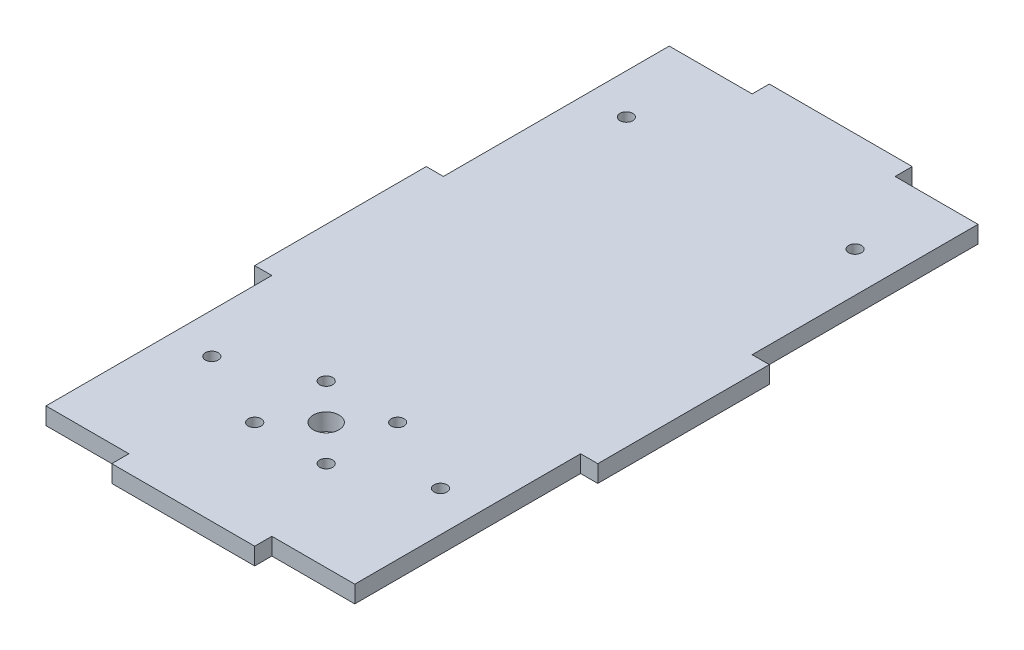
ISO-10303-21;
HEADER;
FILE_DESCRIPTION(('STEP AP214'),'2;1');
FILE_NAME('part.step','',(''),(''),'','','');
FILE_SCHEMA(('AUTOMOTIVE_DESIGN { 1 0 10303 214 1 1 1 1 }'));
ENDSEC;
DATA;
#1=APPLICATION_CONTEXT('core data for automotive mechanical design processes');
#2=APPLICATION_PROTOCOL_DEFINITION('international standard','automotive_design',2000,#1);
#3=PRODUCT_CONTEXT('',#1,'mechanical');
#4=PRODUCT('Part','Part','',(#3));
#5=PRODUCT_RELATED_PRODUCT_CATEGORY('part','',(#4));
#6=PRODUCT_DEFINITION_FORMATION('','',#4);
#7=PRODUCT_DEFINITION_CONTEXT('part definition',#1,'design');
#8=PRODUCT_DEFINITION('design','',#6,#7);
#9=PRODUCT_DEFINITION_SHAPE('','',#8);
#10=(LENGTH_UNIT() NAMED_UNIT(*) SI_UNIT(.MILLI.,.METRE.));
#11=(NAMED_UNIT(*) PLANE_ANGLE_UNIT() SI_UNIT($,.RADIAN.));
#12=(NAMED_UNIT(*) SI_UNIT($,.STERADIAN.) SOLID_ANGLE_UNIT());
#13=UNCERTAINTY_MEASURE_WITH_UNIT(LENGTH_MEASURE(1.E-05),#10,'distance_accuracy_value','');
#14=(GEOMETRIC_REPRESENTATION_CONTEXT(3) GLOBAL_UNCERTAINTY_ASSIGNED_CONTEXT((#13)) GLOBAL_UNIT_ASSIGNED_CONTEXT((#10,
#11,#12)) REPRESENTATION_CONTEXT('',''));
#15=CARTESIAN_POINT('',(0.,0.,0.));
#16=DIRECTION('',(0.,0.,1.));
#17=DIRECTION('',(1.,0.,0.));
#18=AXIS2_PLACEMENT_3D('',#15,#16,#17);
#19=CARTESIAN_POINT('',(0.,-3.,0.));
#20=DIRECTION('',(0.,1.,0.));
#21=DIRECTION('',(0.,0.,1.));
#22=AXIS2_PLACEMENT_3D('',#19,#20,#21);
#23=PLANE('',#22);
#24=CARTESIAN_POINT('',(12.5000000000052,-3.,77.5000000000028));
#25=DIRECTION('',(0.,1.,0.));
#26=DIRECTION('',(0.,0.,1.));
#27=AXIS2_PLACEMENT_3D('',#24,#25,#26);
#28=CIRCLE('',#27,2.25);
#29=CARTESIAN_POINT('',(12.5000000000052,-3.,79.7500000000028));
#30=VERTEX_POINT('',#29);
#31=EDGE_CURVE('E436',#30,#30,#28,.T.);
#32=ORIENTED_EDGE('',*,*,#31,.T.);
#33=EDGE_LOOP('',(#32));
#34=FACE_BOUND('',#33,.T.);
#35=CARTESIAN_POINT('',(-12.4999999999948,-3.,77.5000000000029));
#36=DIRECTION('',(0.,1.,0.));
#37=DIRECTION('',(0.,0.,1.));
#38=AXIS2_PLACEMENT_3D('',#35,#36,#37);
#39=CIRCLE('',#38,2.25);
#40=CARTESIAN_POINT('',(-12.4999999999948,-3.,79.7500000000029));
#41=VERTEX_POINT('',#40);
#42=EDGE_CURVE('E441',#41,#41,#39,.T.);
#43=ORIENTED_EDGE('',*,*,#42,.T.);
#44=EDGE_LOOP('',(#43));
#45=FACE_BOUND('',#44,.T.);
#46=CARTESIAN_POINT('',(12.5000000000052,-3.,52.5000000000028));
#47=DIRECTION('',(0.,1.,0.));
#48=DIRECTION('',(0.,0.,1.));
#49=AXIS2_PLACEMENT_3D('',#46,#47,#48);
#50=CIRCLE('',#49,2.25);
#51=CARTESIAN_POINT('',(12.5000000000052,-3.,54.7500000000028));
#52=VERTEX_POINT('',#51);
#53=EDGE_CURVE('E447',#52,#52,#50,.T.);
#54=ORIENTED_EDGE('',*,*,#53,.T.);
#55=EDGE_LOOP('',(#54));
#56=FACE_BOUND('',#55,.T.);
#57=CARTESIAN_POINT('',(-12.4999999999948,-3.,52.5000000000028));
#58=DIRECTION('',(0.,1.,0.));
#59=DIRECTION('',(0.,0.,1.));
#60=AXIS2_PLACEMENT_3D('',#57,#58,#59);
#61=CIRCLE('',#60,2.25);
#62=CARTESIAN_POINT('',(-12.4999999999948,-3.,54.7500000000028));
#63=VERTEX_POINT('',#62);
#64=EDGE_CURVE('E453',#63,#63,#61,.T.);
#65=ORIENTED_EDGE('',*,*,#64,.T.);
#66=EDGE_LOOP('',(#65));
#67=FACE_BOUND('',#66,.T.);
#68=CARTESIAN_POINT('',(2.29913121009993E-13,-3.,65.));
#69=DIRECTION('',(0.,1.,0.));
#70=DIRECTION('',(0.,0.,1.));
#71=AXIS2_PLACEMENT_3D('',#68,#69,#70);
#72=CIRCLE('',#71,4.5);
#73=CARTESIAN_POINT('',(2.29913121009993E-13,-3.,69.5));
#74=VERTEX_POINT('',#73);
#75=EDGE_CURVE('E206',#74,#74,#72,.T.);
#76=ORIENTED_EDGE('',*,*,#75,.T.);
#77=EDGE_LOOP('',(#76));
#78=FACE_BOUND('',#77,.T.);
#79=DIRECTION('',(-1.,0.,0.));
#80=VECTOR('',#79,1.);
#81=CARTESIAN_POINT('',(25.,-3.,-109.));
#82=LINE('',#81,#80);
#83=CARTESIAN_POINT('',(54.,-3.,-109.));
#84=VERTEX_POINT('',#83);
#85=CARTESIAN_POINT('',(25.,-3.,-109.));
#86=VERTEX_POINT('',#85);
#87=EDGE_CURVE('E202',#84,#86,#82,.T.);
#88=ORIENTED_EDGE('',*,*,#87,.F.);
#89=DIRECTION('',(0.,0.,-1.));
#90=VECTOR('',#89,1.);
#91=CARTESIAN_POINT('',(54.,-3.,-30.));
#92=LINE('',#91,#90);
#93=CARTESIAN_POINT('',(54.,-3.,-30.));
#94=VERTEX_POINT('',#93);
#95=EDGE_CURVE('E121',#94,#84,#92,.T.);
#96=ORIENTED_EDGE('',*,*,#95,.F.);
#97=DIRECTION('',(-1.,0.,0.));
#98=VECTOR('',#97,1.);
#99=CARTESIAN_POINT('',(54.,-3.,-30.));
#100=LINE('',#99,#98);
#101=CARTESIAN_POINT('',(60.,-3.,-30.));
#102=VERTEX_POINT('',#101);
#103=EDGE_CURVE('E115',#102,#94,#100,.T.);
#104=ORIENTED_EDGE('',*,*,#103,.F.);
#105=DIRECTION('',(0.,0.,-1.));
#106=VECTOR('',#105,1.);
#107=CARTESIAN_POINT('',(60.,-3.,-30.));
#108=LINE('',#107,#106);
#109=CARTESIAN_POINT('',(60.,-3.,30.));
#110=VERTEX_POINT('',#109);
#111=EDGE_CURVE('E192',#110,#102,#108,.T.);
#112=ORIENTED_EDGE('',*,*,#111,.F.);
#113=DIRECTION('',(1.,0.,0.));
#114=VECTOR('',#113,1.);
#115=CARTESIAN_POINT('',(54.,-3.,30.));
#116=LINE('',#115,#114);
#117=CARTESIAN_POINT('',(54.,-3.,30.));
#118=VERTEX_POINT('',#117);
#119=EDGE_CURVE('E236',#118,#110,#116,.T.);
#120=ORIENTED_EDGE('',*,*,#119,.F.);
#121=DIRECTION('',(0.,0.,-1.));
#122=VECTOR('',#121,1.);
#123=CARTESIAN_POINT('',(54.,-3.,109.));
#124=LINE('',#123,#122);
#125=CARTESIAN_POINT('',(54.,-3.,109.));
#126=VERTEX_POINT('',#125);
#127=EDGE_CURVE('E234',#126,#118,#124,.T.);
#128=ORIENTED_EDGE('',*,*,#127,.F.);
#129=DIRECTION('',(1.,0.,0.));
#130=VECTOR('',#129,1.);
#131=CARTESIAN_POINT('',(25.,-3.,109.));
#132=LINE('',#131,#130);
#133=CARTESIAN_POINT('',(25.,-3.,109.));
#134=VERTEX_POINT('',#133);
#135=EDGE_CURVE('E232',#134,#126,#132,.T.);
#136=ORIENTED_EDGE('',*,*,#135,.F.);
#137=DIRECTION('',(0.,0.,-1.));
#138=VECTOR('',#137,1.);
#139=CARTESIAN_POINT('',(25.,-3.,109.));
#140=LINE('',#139,#138);
#141=CARTESIAN_POINT('',(25.,-3.,115.));
#142=VERTEX_POINT('',#141);
#143=EDGE_CURVE('E230',#142,#134,#140,.T.);
#144=ORIENTED_EDGE('',*,*,#143,.F.);
#145=DIRECTION('',(1.,0.,0.));
#146=VECTOR('',#145,1.);
#147=CARTESIAN_POINT('',(-24.9999999999999,-3.,115.));
#148=LINE('',#147,#146);
#149=CARTESIAN_POINT('',(-24.9999999999999,-3.,115.));
#150=VERTEX_POINT('',#149);
#151=EDGE_CURVE('E228',#150,#142,#148,.T.);
#152=ORIENTED_EDGE('',*,*,#151,.F.);
#153=DIRECTION('',(0.,0.,1.));
#154=VECTOR('',#153,1.);
#155=CARTESIAN_POINT('',(-25.,-3.,109.));
#156=LINE('',#155,#154);
#157=CARTESIAN_POINT('',(-25.,-3.,109.));
#158=VERTEX_POINT('',#157);
#159=EDGE_CURVE('E226',#158,#150,#156,.T.);
#160=ORIENTED_EDGE('',*,*,#159,.F.);
#161=DIRECTION('',(1.,0.,0.));
#162=VECTOR('',#161,1.);
#163=CARTESIAN_POINT('',(-54.,-3.,109.));
#164=LINE('',#163,#162);
#165=CARTESIAN_POINT('',(-54.,-3.,109.));
#166=VERTEX_POINT('',#165);
#167=EDGE_CURVE('E224',#166,#158,#164,.T.);
#168=ORIENTED_EDGE('',*,*,#167,.F.);
#169=DIRECTION('',(0.,0.,1.));
#170=VECTOR('',#169,1.);
#171=CARTESIAN_POINT('',(-54.,-3.,109.));
#172=LINE('',#171,#170);
#173=CARTESIAN_POINT('',(-54.,-3.,30.));
#174=VERTEX_POINT('',#173);
#175=EDGE_CURVE('E222',#174,#166,#172,.T.);
#176=ORIENTED_EDGE('',*,*,#175,.F.);
#177=DIRECTION('',(1.,0.,0.));
#178=VECTOR('',#177,1.);
#179=CARTESIAN_POINT('',(-54.,-3.,30.));
#180=LINE('',#179,#178);
#181=CARTESIAN_POINT('',(-60.,-3.,30.));
#182=VERTEX_POINT('',#181);
#183=EDGE_CURVE('E220',#182,#174,#180,.T.);
#184=ORIENTED_EDGE('',*,*,#183,.F.);
#185=DIRECTION('',(0.,0.,1.));
#186=VECTOR('',#185,1.);
#187=CARTESIAN_POINT('',(-60.,-3.,-30.));
#188=LINE('',#187,#186);
#189=CARTESIAN_POINT('',(-60.,-3.,-30.));
#190=VERTEX_POINT('',#189);
#191=EDGE_CURVE('E218',#190,#182,#188,.T.);
#192=ORIENTED_EDGE('',*,*,#191,.F.);
#193=DIRECTION('',(-1.,0.,0.));
#194=VECTOR('',#193,1.);
#195=CARTESIAN_POINT('',(-54.,-3.,-30.));
#196=LINE('',#195,#194);
#197=CARTESIAN_POINT('',(-54.,-3.,-30.));
#198=VERTEX_POINT('',#197);
#199=EDGE_CURVE('E216',#198,#190,#196,.T.);
#200=ORIENTED_EDGE('',*,*,#199,.F.);
#201=DIRECTION('',(0.,0.,1.));
#202=VECTOR('',#201,1.);
#203=CARTESIAN_POINT('',(-54.,-3.,-30.));
#204=LINE('',#203,#202);
#205=CARTESIAN_POINT('',(-54.,-3.,-109.));
#206=VERTEX_POINT('',#205);
#207=EDGE_CURVE('E214',#206,#198,#204,.T.);
#208=ORIENTED_EDGE('',*,*,#207,.F.);
#209=DIRECTION('',(-1.,0.,0.));
#210=VECTOR('',#209,1.);
#211=CARTESIAN_POINT('',(-54.,-3.,-109.));
#212=LINE('',#211,#210);
#213=CARTESIAN_POINT('',(-25.,-3.,-109.));
#214=VERTEX_POINT('',#213);
#215=EDGE_CURVE('E212',#214,#206,#212,.T.);
#216=ORIENTED_EDGE('',*,*,#215,.F.);
#217=DIRECTION('',(0.,0.,1.));
#218=VECTOR('',#217,1.);
#219=CARTESIAN_POINT('',(-25.,-3.,-109.));
#220=LINE('',#219,#218);
#221=CARTESIAN_POINT('',(-25.,-3.,-115.));
#222=VERTEX_POINT('',#221);
#223=EDGE_CURVE('E210',#222,#214,#220,.T.);
#224=ORIENTED_EDGE('',*,*,#223,.F.);
#225=DIRECTION('',(-1.,0.,0.));
#226=VECTOR('',#225,1.);
#227=CARTESIAN_POINT('',(-25.,-3.,-115.));
#228=LINE('',#227,#226);
#229=CARTESIAN_POINT('',(25.,-3.,-115.));
#230=VERTEX_POINT('',#229);
#231=EDGE_CURVE('E208',#230,#222,#228,.T.);
#232=ORIENTED_EDGE('',*,*,#231,.F.);
#233=DIRECTION('',(0.,0.,-1.));
#234=VECTOR('',#233,1.);
#235=CARTESIAN_POINT('',(25.,-3.,-109.));
#236=LINE('',#235,#234);
#237=EDGE_CURVE('E205',#86,#230,#236,.T.);
#238=ORIENTED_EDGE('',*,*,#237,.F.);
#239=EDGE_LOOP('',(#88,#96,#104,#112,#120,#128,#136,#144,#152,#160,#168,#176,#184,#192,#200,
#208,#216,#224,#232,#238));
#240=FACE_BOUND('',#239,.T.);
#241=CARTESIAN_POINT('',(40.0000000000052,-3.,65.0000000000028));
#242=DIRECTION('',(0.,-1.,0.));
#243=DIRECTION('',(0.,0.,-1.));
#244=AXIS2_PLACEMENT_3D('',#241,#242,#243);
#245=CIRCLE('',#244,2.25);
#246=CARTESIAN_POINT('',(40.0000000000052,-3.,62.7500000000028));
#247=VERTEX_POINT('',#246);
#248=EDGE_CURVE('E427',#247,#247,#245,.T.);
#249=ORIENTED_EDGE('',*,*,#248,.F.);
#250=EDGE_LOOP('',(#249));
#251=FACE_BOUND('',#250,.T.);
#252=CARTESIAN_POINT('',(-39.9999999999948,-3.,65.0000000000028));
#253=DIRECTION('',(0.,-1.,0.));
#254=DIRECTION('',(0.,0.,-1.));
#255=AXIS2_PLACEMENT_3D('',#252,#253,#254);
#256=CIRCLE('',#255,2.25);
#257=CARTESIAN_POINT('',(-39.9999999999948,-3.,62.7500000000028));
#258=VERTEX_POINT('',#257);
#259=EDGE_CURVE('E421',#258,#258,#256,.T.);
#260=ORIENTED_EDGE('',*,*,#259,.F.);
#261=EDGE_LOOP('',(#260));
#262=FACE_BOUND('',#261,.T.);
#263=CARTESIAN_POINT('',(40.0000000000052,-3.,-79.9999999999972));
#264=DIRECTION('',(0.,-1.,0.));
#265=DIRECTION('',(0.,0.,-1.));
#266=AXIS2_PLACEMENT_3D('',#263,#264,#265);
#267=CIRCLE('',#266,2.25);
#268=CARTESIAN_POINT('',(40.0000000000052,-3.,-82.2499999999972));
#269=VERTEX_POINT('',#268);
#270=EDGE_CURVE('E412',#269,#269,#267,.T.);
#271=ORIENTED_EDGE('',*,*,#270,.F.);
#272=EDGE_LOOP('',(#271));
#273=FACE_BOUND('',#272,.T.);
#274=CARTESIAN_POINT('',(-39.9999999999948,-3.,-79.9999999999972));
#275=DIRECTION('',(0.,-1.,0.));
#276=DIRECTION('',(0.,0.,-1.));
#277=AXIS2_PLACEMENT_3D('',#274,#275,#276);
#278=CIRCLE('',#277,2.25);
#279=CARTESIAN_POINT('',(-39.9999999999948,-3.,-82.2499999999972));
#280=VERTEX_POINT('',#279);
#281=EDGE_CURVE('E408',#280,#280,#278,.T.);
#282=ORIENTED_EDGE('',*,*,#281,.F.);
#283=EDGE_LOOP('',(#282));
#284=FACE_BOUND('',#283,.T.);
#285=ADVANCED_FACE('F33',(#34,#45,#56,#67,#78,#240,#251,#262,#273,#284),#23,.F.);
#286=CARTESIAN_POINT('',(25.,3.,-109.));
#287=DIRECTION('',(0.,0.,1.));
#288=DIRECTION('',(1.,0.,0.));
#289=AXIS2_PLACEMENT_3D('',#286,#287,#288);
#290=PLANE('',#289);
#291=ORIENTED_EDGE('',*,*,#87,.T.);
#292=DIRECTION('',(0.,-1.,0.));
#293=VECTOR('',#292,1.);
#294=CARTESIAN_POINT('',(25.,3.,-109.));
#295=LINE('',#294,#293);
#296=CARTESIAN_POINT('',(25.,3.,-109.));
#297=VERTEX_POINT('',#296);
#298=EDGE_CURVE('E11',#297,#86,#295,.T.);
#299=ORIENTED_EDGE('',*,*,#298,.F.);
#300=DIRECTION('',(-1.,0.,0.));
#301=VECTOR('',#300,1.);
#302=CARTESIAN_POINT('',(25.,3.,-109.));
#303=LINE('',#302,#301);
#304=CARTESIAN_POINT('',(54.,3.,-109.));
#305=VERTEX_POINT('',#304);
#306=EDGE_CURVE('E241',#305,#297,#303,.T.);
#307=ORIENTED_EDGE('',*,*,#306,.F.);
#308=DIRECTION('',(0.,-1.,0.));
#309=VECTOR('',#308,1.);
#310=CARTESIAN_POINT('',(54.,3.,-109.));
#311=LINE('',#310,#309);
#312=EDGE_CURVE('E198',#305,#84,#311,.T.);
#313=ORIENTED_EDGE('',*,*,#312,.T.);
#314=EDGE_LOOP('',(#291,#299,#307,#313));
#315=FACE_BOUND('',#314,.T.);
#316=ADVANCED_FACE('F35',(#315),#290,.F.);
#317=CARTESIAN_POINT('',(25.,3.,-109.));
#318=DIRECTION('',(-1.,0.,0.));
#319=DIRECTION('',(0.,0.,1.));
#320=AXIS2_PLACEMENT_3D('',#317,#318,#319);
#321=PLANE('',#320);
#322=ORIENTED_EDGE('',*,*,#237,.T.);
#323=DIRECTION('',(0.,-1.,0.));
#324=VECTOR('',#323,1.);
#325=CARTESIAN_POINT('',(25.,3.,-115.));
#326=LINE('',#325,#324);
#327=CARTESIAN_POINT('',(25.,3.,-115.));
#328=VERTEX_POINT('',#327);
#329=EDGE_CURVE('E42',#328,#230,#326,.T.);
#330=ORIENTED_EDGE('',*,*,#329,.F.);
#331=DIRECTION('',(0.,0.,-1.));
#332=VECTOR('',#331,1.);
#333=CARTESIAN_POINT('',(25.,3.,-109.));
#334=LINE('',#333,#332);
#335=EDGE_CURVE('E129',#297,#328,#334,.T.);
#336=ORIENTED_EDGE('',*,*,#335,.F.);
#337=ORIENTED_EDGE('',*,*,#298,.T.);
#338=EDGE_LOOP('',(#322,#330,#336,#337));
#339=FACE_BOUND('',#338,.T.);
#340=ADVANCED_FACE('F365',(#339),#321,.F.);
#341=CARTESIAN_POINT('',(-25.,3.,-115.));
#342=DIRECTION('',(0.,0.,1.));
#343=DIRECTION('',(1.,0.,0.));
#344=AXIS2_PLACEMENT_3D('',#341,#342,#343);
#345=PLANE('',#344);
#346=ORIENTED_EDGE('',*,*,#231,.T.);
#347=DIRECTION('',(0.,-1.,0.));
#348=VECTOR('',#347,1.);
#349=CARTESIAN_POINT('',(-25.,3.,-115.));
#350=LINE('',#349,#348);
#351=CARTESIAN_POINT('',(-25.,3.,-115.));
#352=VERTEX_POINT('',#351);
#353=EDGE_CURVE('E284',#352,#222,#350,.T.);
#354=ORIENTED_EDGE('',*,*,#353,.F.);
#355=DIRECTION('',(-1.,0.,0.));
#356=VECTOR('',#355,1.);
#357=CARTESIAN_POINT('',(-25.,3.,-115.));
#358=LINE('',#357,#356);
#359=EDGE_CURVE('E292',#328,#352,#358,.T.);
#360=ORIENTED_EDGE('',*,*,#359,.F.);
#361=ORIENTED_EDGE('',*,*,#329,.T.);
#362=EDGE_LOOP('',(#346,#354,#360,#361));
#363=FACE_BOUND('',#362,.T.);
#364=ADVANCED_FACE('F290',(#363),#345,.F.);
#365=CARTESIAN_POINT('',(-25.,3.,-109.));
#366=DIRECTION('',(1.,0.,0.));
#367=DIRECTION('',(0.,0.,-1.));
#368=AXIS2_PLACEMENT_3D('',#365,#366,#367);
#369=PLANE('',#368);
#370=ORIENTED_EDGE('',*,*,#223,.T.);
#371=DIRECTION('',(0.,-1.,0.));
#372=VECTOR('',#371,1.);
#373=CARTESIAN_POINT('',(-25.,3.,-109.));
#374=LINE('',#373,#372);
#375=CARTESIAN_POINT('',(-25.,3.,-109.));
#376=VERTEX_POINT('',#375);
#377=EDGE_CURVE('E281',#376,#214,#374,.T.);
#378=ORIENTED_EDGE('',*,*,#377,.F.);
#379=DIRECTION('',(0.,0.,1.));
#380=VECTOR('',#379,1.);
#381=CARTESIAN_POINT('',(-25.,3.,-109.));
#382=LINE('',#381,#380);
#383=EDGE_CURVE('E310',#352,#376,#382,.T.);
#384=ORIENTED_EDGE('',*,*,#383,.F.);
#385=ORIENTED_EDGE('',*,*,#353,.T.);
#386=EDGE_LOOP('',(#370,#378,#384,#385));
#387=FACE_BOUND('',#386,.T.);
#388=ADVANCED_FACE('F301',(#387),#369,.F.);
#389=CARTESIAN_POINT('',(-54.,3.,-109.));
#390=DIRECTION('',(0.,0.,1.));
#391=DIRECTION('',(1.,0.,0.));
#392=AXIS2_PLACEMENT_3D('',#389,#390,#391);
#393=PLANE('',#392);
#394=ORIENTED_EDGE('',*,*,#215,.T.);
#395=DIRECTION('',(0.,-1.,0.));
#396=VECTOR('',#395,1.);
#397=CARTESIAN_POINT('',(-54.,3.,-109.));
#398=LINE('',#397,#396);
#399=CARTESIAN_POINT('',(-54.,3.,-109.));
#400=VERTEX_POINT('',#399);
#401=EDGE_CURVE('E278',#400,#206,#398,.T.);
#402=ORIENTED_EDGE('',*,*,#401,.F.);
#403=DIRECTION('',(-1.,0.,0.));
#404=VECTOR('',#403,1.);
#405=CARTESIAN_POINT('',(-54.,3.,-109.));
#406=LINE('',#405,#404);
#407=EDGE_CURVE('E307',#376,#400,#406,.T.);
#408=ORIENTED_EDGE('',*,*,#407,.F.);
#409=ORIENTED_EDGE('',*,*,#377,.T.);
#410=EDGE_LOOP('',(#394,#402,#408,#409));
#411=FACE_BOUND('',#410,.T.);
#412=ADVANCED_FACE('F305',(#411),#393,.F.);
#413=CARTESIAN_POINT('',(-54.,3.,-30.));
#414=DIRECTION('',(1.,0.,0.));
#415=DIRECTION('',(0.,0.,-1.));
#416=AXIS2_PLACEMENT_3D('',#413,#414,#415);
#417=PLANE('',#416);
#418=ORIENTED_EDGE('',*,*,#207,.T.);
#419=DIRECTION('',(0.,-1.,0.));
#420=VECTOR('',#419,1.);
#421=CARTESIAN_POINT('',(-54.,3.,-30.));
#422=LINE('',#421,#420);
#423=CARTESIAN_POINT('',(-54.,3.,-30.));
#424=VERTEX_POINT('',#423);
#425=EDGE_CURVE('E275',#424,#198,#422,.T.);
#426=ORIENTED_EDGE('',*,*,#425,.F.);
#427=DIRECTION('',(0.,0.,1.));
#428=VECTOR('',#427,1.);
#429=CARTESIAN_POINT('',(-54.,3.,-30.));
#430=LINE('',#429,#428);
#431=EDGE_CURVE('E309',#400,#424,#430,.T.);
#432=ORIENTED_EDGE('',*,*,#431,.F.);
#433=ORIENTED_EDGE('',*,*,#401,.T.);
#434=EDGE_LOOP('',(#418,#426,#432,#433));
#435=FACE_BOUND('',#434,.T.);
#436=ADVANCED_FACE('F671',(#435),#417,.F.);
#437=CARTESIAN_POINT('',(-54.,3.,-30.));
#438=DIRECTION('',(0.,0.,1.));
#439=DIRECTION('',(1.,0.,0.));
#440=AXIS2_PLACEMENT_3D('',#437,#438,#439);
#441=PLANE('',#440);
#442=ORIENTED_EDGE('',*,*,#199,.T.);
#443=DIRECTION('',(0.,-1.,0.));
#444=VECTOR('',#443,1.);
#445=CARTESIAN_POINT('',(-60.,3.,-30.));
#446=LINE('',#445,#444);
#447=CARTESIAN_POINT('',(-60.,3.,-30.));
#448=VERTEX_POINT('',#447);
#449=EDGE_CURVE('E272',#448,#190,#446,.T.);
#450=ORIENTED_EDGE('',*,*,#449,.F.);
#451=DIRECTION('',(-1.,0.,0.));
#452=VECTOR('',#451,1.);
#453=CARTESIAN_POINT('',(-54.,3.,-30.));
#454=LINE('',#453,#452);
#455=EDGE_CURVE('E312',#424,#448,#454,.T.);
#456=ORIENTED_EDGE('',*,*,#455,.F.);
#457=ORIENTED_EDGE('',*,*,#425,.T.);
#458=EDGE_LOOP('',(#442,#450,#456,#457));
#459=FACE_BOUND('',#458,.T.);
#460=ADVANCED_FACE('F662',(#459),#441,.F.);
#461=CARTESIAN_POINT('',(-60.,3.,-30.));
#462=DIRECTION('',(1.,0.,0.));
#463=DIRECTION('',(0.,0.,-1.));
#464=AXIS2_PLACEMENT_3D('',#461,#462,#463);
#465=PLANE('',#464);
#466=ORIENTED_EDGE('',*,*,#191,.T.);
#467=DIRECTION('',(0.,-1.,0.));
#468=VECTOR('',#467,1.);
#469=CARTESIAN_POINT('',(-60.,3.,30.));
#470=LINE('',#469,#468);
#471=CARTESIAN_POINT('',(-60.,3.,30.));
#472=VERTEX_POINT('',#471);
#473=EDGE_CURVE('E269',#472,#182,#470,.T.);
#474=ORIENTED_EDGE('',*,*,#473,.F.);
#475=DIRECTION('',(0.,0.,1.));
#476=VECTOR('',#475,1.);
#477=CARTESIAN_POINT('',(-60.,3.,-30.));
#478=LINE('',#477,#476);
#479=EDGE_CURVE('E318',#448,#472,#478,.T.);
#480=ORIENTED_EDGE('',*,*,#479,.F.);
#481=ORIENTED_EDGE('',*,*,#449,.T.);
#482=EDGE_LOOP('',(#466,#474,#480,#481));
#483=FACE_BOUND('',#482,.T.);
#484=ADVANCED_FACE('F653',(#483),#465,.F.);
#485=CARTESIAN_POINT('',(-54.,3.,30.));
#486=DIRECTION('',(0.,0.,-1.));
#487=DIRECTION('',(-1.,0.,0.));
#488=AXIS2_PLACEMENT_3D('',#485,#486,#487);
#489=PLANE('',#488);
#490=ORIENTED_EDGE('',*,*,#183,.T.);
#491=DIRECTION('',(0.,-1.,0.));
#492=VECTOR('',#491,1.);
#493=CARTESIAN_POINT('',(-54.,3.,30.));
#494=LINE('',#493,#492);
#495=CARTESIAN_POINT('',(-54.,3.,30.));
#496=VERTEX_POINT('',#495);
#497=EDGE_CURVE('E266',#496,#174,#494,.T.);
#498=ORIENTED_EDGE('',*,*,#497,.F.);
#499=DIRECTION('',(1.,0.,0.));
#500=VECTOR('',#499,1.);
#501=CARTESIAN_POINT('',(-54.,3.,30.));
#502=LINE('',#501,#500);
#503=EDGE_CURVE('E320',#472,#496,#502,.T.);
#504=ORIENTED_EDGE('',*,*,#503,.F.);
#505=ORIENTED_EDGE('',*,*,#473,.T.);
#506=EDGE_LOOP('',(#490,#498,#504,#505));
#507=FACE_BOUND('',#506,.T.);
#508=ADVANCED_FACE('F644',(#507),#489,.F.);
#509=CARTESIAN_POINT('',(-54.,3.,109.));
#510=DIRECTION('',(1.,0.,0.));
#511=DIRECTION('',(0.,0.,-1.));
#512=AXIS2_PLACEMENT_3D('',#509,#510,#511);
#513=PLANE('',#512);
#514=ORIENTED_EDGE('',*,*,#175,.T.);
#515=DIRECTION('',(0.,-1.,0.));
#516=VECTOR('',#515,1.);
#517=CARTESIAN_POINT('',(-54.,3.,109.));
#518=LINE('',#517,#516);
#519=CARTESIAN_POINT('',(-54.,3.,109.));
#520=VERTEX_POINT('',#519);
#521=EDGE_CURVE('E263',#520,#166,#518,.T.);
#522=ORIENTED_EDGE('',*,*,#521,.F.);
#523=DIRECTION('',(0.,0.,1.));
#524=VECTOR('',#523,1.);
#525=CARTESIAN_POINT('',(-54.,3.,109.));
#526=LINE('',#525,#524);
#527=EDGE_CURVE('E322',#496,#520,#526,.T.);
#528=ORIENTED_EDGE('',*,*,#527,.F.);
#529=ORIENTED_EDGE('',*,*,#497,.T.);
#530=EDGE_LOOP('',(#514,#522,#528,#529));
#531=FACE_BOUND('',#530,.T.);
#532=ADVANCED_FACE('F635',(#531),#513,.F.);
#533=CARTESIAN_POINT('',(-54.,3.,109.));
#534=DIRECTION('',(0.,0.,-1.));
#535=DIRECTION('',(-1.,0.,0.));
#536=AXIS2_PLACEMENT_3D('',#533,#534,#535);
#537=PLANE('',#536);
#538=ORIENTED_EDGE('',*,*,#167,.T.);
#539=DIRECTION('',(0.,-1.,0.));
#540=VECTOR('',#539,1.);
#541=CARTESIAN_POINT('',(-25.,3.,109.));
#542=LINE('',#541,#540);
#543=CARTESIAN_POINT('',(-25.,3.,109.));
#544=VERTEX_POINT('',#543);
#545=EDGE_CURVE('E260',#544,#158,#542,.T.);
#546=ORIENTED_EDGE('',*,*,#545,.F.);
#547=DIRECTION('',(1.,0.,0.));
#548=VECTOR('',#547,1.);
#549=CARTESIAN_POINT('',(-54.,3.,109.));
#550=LINE('',#549,#548);
#551=EDGE_CURVE('E324',#520,#544,#550,.T.);
#552=ORIENTED_EDGE('',*,*,#551,.F.);
#553=ORIENTED_EDGE('',*,*,#521,.T.);
#554=EDGE_LOOP('',(#538,#546,#552,#553));
#555=FACE_BOUND('',#554,.T.);
#556=ADVANCED_FACE('F626',(#555),#537,.F.);
#557=CARTESIAN_POINT('',(-25.,3.,109.));
#558=DIRECTION('',(1.,0.,0.));
#559=DIRECTION('',(0.,0.,-1.));
#560=AXIS2_PLACEMENT_3D('',#557,#558,#559);
#561=PLANE('',#560);
#562=ORIENTED_EDGE('',*,*,#159,.T.);
#563=DIRECTION('',(0.,-1.,0.));
#564=VECTOR('',#563,1.);
#565=CARTESIAN_POINT('',(-24.9999999999999,3.,115.));
#566=LINE('',#565,#564);
#567=CARTESIAN_POINT('',(-24.9999999999999,3.,115.));
#568=VERTEX_POINT('',#567);
#569=EDGE_CURVE('E257',#568,#150,#566,.T.);
#570=ORIENTED_EDGE('',*,*,#569,.F.);
#571=DIRECTION('',(0.,0.,1.));
#572=VECTOR('',#571,1.);
#573=CARTESIAN_POINT('',(-25.,3.,109.));
#574=LINE('',#573,#572);
#575=EDGE_CURVE('E326',#544,#568,#574,.T.);
#576=ORIENTED_EDGE('',*,*,#575,.F.);
#577=ORIENTED_EDGE('',*,*,#545,.T.);
#578=EDGE_LOOP('',(#562,#570,#576,#577));
#579=FACE_BOUND('',#578,.T.);
#580=ADVANCED_FACE('F617',(#579),#561,.F.);
#581=CARTESIAN_POINT('',(-24.9999999999999,3.,115.));
#582=DIRECTION('',(0.,0.,-1.));
#583=DIRECTION('',(-1.,0.,0.));
#584=AXIS2_PLACEMENT_3D('',#581,#582,#583);
#585=PLANE('',#584);
#586=ORIENTED_EDGE('',*,*,#151,.T.);
#587=DIRECTION('',(0.,-1.,0.));
#588=VECTOR('',#587,1.);
#589=CARTESIAN_POINT('',(25.,3.,115.));
#590=LINE('',#589,#588);
#591=CARTESIAN_POINT('',(25.,3.,115.));
#592=VERTEX_POINT('',#591);
#593=EDGE_CURVE('E254',#592,#142,#590,.T.);
#594=ORIENTED_EDGE('',*,*,#593,.F.);
#595=DIRECTION('',(1.,0.,0.));
#596=VECTOR('',#595,1.);
#597=CARTESIAN_POINT('',(-24.9999999999999,3.,115.));
#598=LINE('',#597,#596);
#599=EDGE_CURVE('E328',#568,#592,#598,.T.);
#600=ORIENTED_EDGE('',*,*,#599,.F.);
#601=ORIENTED_EDGE('',*,*,#569,.T.);
#602=EDGE_LOOP('',(#586,#594,#600,#601));
#603=FACE_BOUND('',#602,.T.);
#604=ADVANCED_FACE('F608',(#603),#585,.F.);
#605=CARTESIAN_POINT('',(25.,3.,109.));
#606=DIRECTION('',(-1.,0.,0.));
#607=DIRECTION('',(0.,0.,1.));
#608=AXIS2_PLACEMENT_3D('',#605,#606,#607);
#609=PLANE('',#608);
#610=ORIENTED_EDGE('',*,*,#143,.T.);
#611=DIRECTION('',(0.,-1.,0.));
#612=VECTOR('',#611,1.);
#613=CARTESIAN_POINT('',(25.,3.,109.));
#614=LINE('',#613,#612);
#615=CARTESIAN_POINT('',(25.,3.,109.));
#616=VERTEX_POINT('',#615);
#617=EDGE_CURVE('E251',#616,#134,#614,.T.);
#618=ORIENTED_EDGE('',*,*,#617,.F.);
#619=DIRECTION('',(0.,0.,-1.));
#620=VECTOR('',#619,1.);
#621=CARTESIAN_POINT('',(25.,3.,109.));
#622=LINE('',#621,#620);
#623=EDGE_CURVE('E330',#592,#616,#622,.T.);
#624=ORIENTED_EDGE('',*,*,#623,.F.);
#625=ORIENTED_EDGE('',*,*,#593,.T.);
#626=EDGE_LOOP('',(#610,#618,#624,#625));
#627=FACE_BOUND('',#626,.T.);
#628=ADVANCED_FACE('F599',(#627),#609,.F.);
#629=CARTESIAN_POINT('',(25.,3.,109.));
#630=DIRECTION('',(0.,0.,-1.));
#631=DIRECTION('',(-1.,0.,0.));
#632=AXIS2_PLACEMENT_3D('',#629,#630,#631);
#633=PLANE('',#632);
#634=ORIENTED_EDGE('',*,*,#135,.T.);
#635=DIRECTION('',(0.,-1.,0.));
#636=VECTOR('',#635,1.);
#637=CARTESIAN_POINT('',(54.,3.,109.));
#638=LINE('',#637,#636);
#639=CARTESIAN_POINT('',(54.,3.,109.));
#640=VERTEX_POINT('',#639);
#641=EDGE_CURVE('E248',#640,#126,#638,.T.);
#642=ORIENTED_EDGE('',*,*,#641,.F.);
#643=DIRECTION('',(1.,0.,0.));
#644=VECTOR('',#643,1.);
#645=CARTESIAN_POINT('',(25.,3.,109.));
#646=LINE('',#645,#644);
#647=EDGE_CURVE('E332',#616,#640,#646,.T.);
#648=ORIENTED_EDGE('',*,*,#647,.F.);
#649=ORIENTED_EDGE('',*,*,#617,.T.);
#650=EDGE_LOOP('',(#634,#642,#648,#649));
#651=FACE_BOUND('',#650,.T.);
#652=ADVANCED_FACE('F591',(#651),#633,.F.);
#653=CARTESIAN_POINT('',(54.,3.,109.));
#654=DIRECTION('',(-1.,0.,0.));
#655=DIRECTION('',(0.,0.,1.));
#656=AXIS2_PLACEMENT_3D('',#653,#654,#655);
#657=PLANE('',#656);
#658=ORIENTED_EDGE('',*,*,#127,.T.);
#659=DIRECTION('',(0.,-1.,0.));
#660=VECTOR('',#659,1.);
#661=CARTESIAN_POINT('',(54.,3.,30.));
#662=LINE('',#661,#660);
#663=CARTESIAN_POINT('',(54.,3.,30.));
#664=VERTEX_POINT('',#663);
#665=EDGE_CURVE('E245',#664,#118,#662,.T.);
#666=ORIENTED_EDGE('',*,*,#665,.F.);
#667=DIRECTION('',(0.,0.,-1.));
#668=VECTOR('',#667,1.);
#669=CARTESIAN_POINT('',(54.,3.,109.));
#670=LINE('',#669,#668);
#671=EDGE_CURVE('E334',#640,#664,#670,.T.);
#672=ORIENTED_EDGE('',*,*,#671,.F.);
#673=ORIENTED_EDGE('',*,*,#641,.T.);
#674=EDGE_LOOP('',(#658,#666,#672,#673));
#675=FACE_BOUND('',#674,.T.);
#676=ADVANCED_FACE('F340',(#675),#657,.F.);
#677=CARTESIAN_POINT('',(54.,3.,30.));
#678=DIRECTION('',(0.,0.,-1.));
#679=DIRECTION('',(-1.,0.,0.));
#680=AXIS2_PLACEMENT_3D('',#677,#678,#679);
#681=PLANE('',#680);
#682=ORIENTED_EDGE('',*,*,#119,.T.);
#683=DIRECTION('',(0.,-1.,0.));
#684=VECTOR('',#683,1.);
#685=CARTESIAN_POINT('',(60.,3.,30.));
#686=LINE('',#685,#684);
#687=CARTESIAN_POINT('',(60.,3.,30.));
#688=VERTEX_POINT('',#687);
#689=EDGE_CURVE('E193',#688,#110,#686,.T.);
#690=ORIENTED_EDGE('',*,*,#689,.F.);
#691=DIRECTION('',(1.,0.,0.));
#692=VECTOR('',#691,1.);
#693=CARTESIAN_POINT('',(54.,3.,30.));
#694=LINE('',#693,#692);
#695=EDGE_CURVE('E184',#664,#688,#694,.T.);
#696=ORIENTED_EDGE('',*,*,#695,.F.);
#697=ORIENTED_EDGE('',*,*,#665,.T.);
#698=EDGE_LOOP('',(#682,#690,#696,#697));
#699=FACE_BOUND('',#698,.T.);
#700=ADVANCED_FACE('F344',(#699),#681,.F.);
#701=CARTESIAN_POINT('',(60.,3.,-30.));
#702=DIRECTION('',(-1.,0.,0.));
#703=DIRECTION('',(0.,0.,1.));
#704=AXIS2_PLACEMENT_3D('',#701,#702,#703);
#705=PLANE('',#704);
#706=ORIENTED_EDGE('',*,*,#111,.T.);
#707=DIRECTION('',(0.,-1.,0.));
#708=VECTOR('',#707,1.);
#709=CARTESIAN_POINT('',(60.,3.,-30.));
#710=LINE('',#709,#708);
#711=CARTESIAN_POINT('',(60.,3.,-30.));
#712=VERTEX_POINT('',#711);
#713=EDGE_CURVE('E189',#712,#102,#710,.T.);
#714=ORIENTED_EDGE('',*,*,#713,.F.);
#715=DIRECTION('',(0.,0.,-1.));
#716=VECTOR('',#715,1.);
#717=CARTESIAN_POINT('',(60.,3.,-30.));
#718=LINE('',#717,#716);
#719=EDGE_CURVE('E178',#688,#712,#718,.T.);
#720=ORIENTED_EDGE('',*,*,#719,.F.);
#721=ORIENTED_EDGE('',*,*,#689,.T.);
#722=EDGE_LOOP('',(#706,#714,#720,#721));
#723=FACE_BOUND('',#722,.T.);
#724=ADVANCED_FACE('F190',(#723),#705,.F.);
#725=CARTESIAN_POINT('',(54.,3.,-30.));
#726=DIRECTION('',(0.,0.,1.));
#727=DIRECTION('',(1.,0.,0.));
#728=AXIS2_PLACEMENT_3D('',#725,#726,#727);
#729=PLANE('',#728);
#730=ORIENTED_EDGE('',*,*,#103,.T.);
#731=DIRECTION('',(0.,-1.,0.));
#732=VECTOR('',#731,1.);
#733=CARTESIAN_POINT('',(54.,3.,-30.));
#734=LINE('',#733,#732);
#735=CARTESIAN_POINT('',(54.,3.,-30.));
#736=VERTEX_POINT('',#735);
#737=EDGE_CURVE('E194',#736,#94,#734,.T.);
#738=ORIENTED_EDGE('',*,*,#737,.F.);
#739=DIRECTION('',(-1.,0.,0.));
#740=VECTOR('',#739,1.);
#741=CARTESIAN_POINT('',(54.,3.,-30.));
#742=LINE('',#741,#740);
#743=EDGE_CURVE('E182',#712,#736,#742,.T.);
#744=ORIENTED_EDGE('',*,*,#743,.F.);
#745=ORIENTED_EDGE('',*,*,#713,.T.);
#746=EDGE_LOOP('',(#730,#738,#744,#745));
#747=FACE_BOUND('',#746,.T.);
#748=ADVANCED_FACE('F196',(#747),#729,.F.);
#749=CARTESIAN_POINT('',(54.,3.,-30.));
#750=DIRECTION('',(-1.,0.,0.));
#751=DIRECTION('',(0.,0.,1.));
#752=AXIS2_PLACEMENT_3D('',#749,#750,#751);
#753=PLANE('',#752);
#754=ORIENTED_EDGE('',*,*,#95,.T.);
#755=ORIENTED_EDGE('',*,*,#312,.F.);
#756=DIRECTION('',(0.,0.,-1.));
#757=VECTOR('',#756,1.);
#758=CARTESIAN_POINT('',(54.,3.,-30.));
#759=LINE('',#758,#757);
#760=EDGE_CURVE('E50',#736,#305,#759,.T.);
#761=ORIENTED_EDGE('',*,*,#760,.F.);
#762=ORIENTED_EDGE('',*,*,#737,.T.);
#763=EDGE_LOOP('',(#754,#755,#761,#762));
#764=FACE_BOUND('',#763,.T.);
#765=ADVANCED_FACE('F348',(#764),#753,.F.);
#766=CARTESIAN_POINT('',(0.,3.,0.));
#767=DIRECTION('',(0.,1.,0.));
#768=DIRECTION('',(0.,0.,1.));
#769=AXIS2_PLACEMENT_3D('',#766,#767,#768);
#770=PLANE('',#769);
#771=CARTESIAN_POINT('',(-39.9999999999948,3.,-79.9999999999972));
#772=DIRECTION('',(0.,1.,0.));
#773=DIRECTION('',(0.,0.,1.));
#774=AXIS2_PLACEMENT_3D('',#771,#772,#773);
#775=CIRCLE('',#774,2.25);
#776=CARTESIAN_POINT('',(-39.9999999999948,3.,-77.7499999999972));
#777=VERTEX_POINT('',#776);
#778=EDGE_CURVE('E411',#777,#777,#775,.T.);
#779=ORIENTED_EDGE('',*,*,#778,.F.);
#780=EDGE_LOOP('',(#779));
#781=FACE_BOUND('',#780,.T.);
#782=CARTESIAN_POINT('',(40.0000000000052,3.,-79.9999999999972));
#783=DIRECTION('',(0.,1.,0.));
#784=DIRECTION('',(0.,0.,1.));
#785=AXIS2_PLACEMENT_3D('',#782,#783,#784);
#786=CIRCLE('',#785,2.25);
#787=CARTESIAN_POINT('',(40.0000000000052,3.,-77.7499999999972));
#788=VERTEX_POINT('',#787);
#789=EDGE_CURVE('E415',#788,#788,#786,.T.);
#790=ORIENTED_EDGE('',*,*,#789,.F.);
#791=EDGE_LOOP('',(#790));
#792=FACE_BOUND('',#791,.T.);
#793=CARTESIAN_POINT('',(-39.9999999999948,3.,65.0000000000028));
#794=DIRECTION('',(0.,1.,0.));
#795=DIRECTION('',(0.,0.,1.));
#796=AXIS2_PLACEMENT_3D('',#793,#794,#795);
#797=CIRCLE('',#796,2.25);
#798=CARTESIAN_POINT('',(-39.9999999999948,3.,67.2500000000028));
#799=VERTEX_POINT('',#798);
#800=EDGE_CURVE('E424',#799,#799,#797,.T.);
#801=ORIENTED_EDGE('',*,*,#800,.F.);
#802=EDGE_LOOP('',(#801));
#803=FACE_BOUND('',#802,.T.);
#804=CARTESIAN_POINT('',(40.0000000000052,3.,65.0000000000028));
#805=DIRECTION('',(0.,1.,0.));
#806=DIRECTION('',(0.,0.,1.));
#807=AXIS2_PLACEMENT_3D('',#804,#805,#806);
#808=CIRCLE('',#807,2.25);
#809=CARTESIAN_POINT('',(40.0000000000052,3.,67.2500000000028));
#810=VERTEX_POINT('',#809);
#811=EDGE_CURVE('E430',#810,#810,#808,.T.);
#812=ORIENTED_EDGE('',*,*,#811,.F.);
#813=EDGE_LOOP('',(#812));
#814=FACE_BOUND('',#813,.T.);
#815=CARTESIAN_POINT('',(12.5000000000052,3.,77.5000000000028));
#816=DIRECTION('',(0.,1.,0.));
#817=DIRECTION('',(0.,0.,1.));
#818=AXIS2_PLACEMENT_3D('',#815,#816,#817);
#819=CIRCLE('',#818,2.25);
#820=CARTESIAN_POINT('',(12.5000000000052,3.,79.7500000000028));
#821=VERTEX_POINT('',#820);
#822=EDGE_CURVE('E433',#821,#821,#819,.T.);
#823=ORIENTED_EDGE('',*,*,#822,.F.);
#824=EDGE_LOOP('',(#823));
#825=FACE_BOUND('',#824,.T.);
#826=CARTESIAN_POINT('',(-12.4999999999948,3.,77.5000000000029));
#827=DIRECTION('',(0.,1.,0.));
#828=DIRECTION('',(0.,0.,1.));
#829=AXIS2_PLACEMENT_3D('',#826,#827,#828);
#830=CIRCLE('',#829,2.25);
#831=CARTESIAN_POINT('',(-12.4999999999948,3.,79.7500000000029));
#832=VERTEX_POINT('',#831);
#833=EDGE_CURVE('E438',#832,#832,#830,.T.);
#834=ORIENTED_EDGE('',*,*,#833,.F.);
#835=EDGE_LOOP('',(#834));
#836=FACE_BOUND('',#835,.T.);
#837=CARTESIAN_POINT('',(12.5000000000052,3.,52.5000000000028));
#838=DIRECTION('',(0.,1.,0.));
#839=DIRECTION('',(0.,0.,1.));
#840=AXIS2_PLACEMENT_3D('',#837,#838,#839);
#841=CIRCLE('',#840,2.25);
#842=CARTESIAN_POINT('',(12.5000000000052,3.,54.7500000000028));
#843=VERTEX_POINT('',#842);
#844=EDGE_CURVE('E444',#843,#843,#841,.T.);
#845=ORIENTED_EDGE('',*,*,#844,.F.);
#846=EDGE_LOOP('',(#845));
#847=FACE_BOUND('',#846,.T.);
#848=CARTESIAN_POINT('',(-12.4999999999948,3.,52.5000000000028));
#849=DIRECTION('',(0.,1.,0.));
#850=DIRECTION('',(0.,0.,1.));
#851=AXIS2_PLACEMENT_3D('',#848,#849,#850);
#852=CIRCLE('',#851,2.25);
#853=CARTESIAN_POINT('',(-12.4999999999948,3.,54.7500000000028));
#854=VERTEX_POINT('',#853);
#855=EDGE_CURVE('E450',#854,#854,#852,.T.);
#856=ORIENTED_EDGE('',*,*,#855,.F.);
#857=EDGE_LOOP('',(#856));
#858=FACE_BOUND('',#857,.T.);
#859=CARTESIAN_POINT('',(2.29913121009993E-13,3.,65.));
#860=DIRECTION('',(0.,1.,0.));
#861=DIRECTION('',(0.,0.,1.));
#862=AXIS2_PLACEMENT_3D('',#859,#860,#861);
#863=CIRCLE('',#862,4.5);
#864=CARTESIAN_POINT('',(2.29913121009993E-13,3.,69.5));
#865=VERTEX_POINT('',#864);
#866=EDGE_CURVE('E456',#865,#865,#863,.T.);
#867=ORIENTED_EDGE('',*,*,#866,.F.);
#868=EDGE_LOOP('',(#867));
#869=FACE_BOUND('',#868,.T.);
#870=ORIENTED_EDGE('',*,*,#306,.T.);
#871=ORIENTED_EDGE('',*,*,#335,.T.);
#872=ORIENTED_EDGE('',*,*,#359,.T.);
#873=ORIENTED_EDGE('',*,*,#383,.T.);
#874=ORIENTED_EDGE('',*,*,#407,.T.);
#875=ORIENTED_EDGE('',*,*,#431,.T.);
#876=ORIENTED_EDGE('',*,*,#455,.T.);
#877=ORIENTED_EDGE('',*,*,#479,.T.);
#878=ORIENTED_EDGE('',*,*,#503,.T.);
#879=ORIENTED_EDGE('',*,*,#527,.T.);
#880=ORIENTED_EDGE('',*,*,#551,.T.);
#881=ORIENTED_EDGE('',*,*,#575,.T.);
#882=ORIENTED_EDGE('',*,*,#599,.T.);
#883=ORIENTED_EDGE('',*,*,#623,.T.);
#884=ORIENTED_EDGE('',*,*,#647,.T.);
#885=ORIENTED_EDGE('',*,*,#671,.T.);
#886=ORIENTED_EDGE('',*,*,#695,.T.);
#887=ORIENTED_EDGE('',*,*,#719,.T.);
#888=ORIENTED_EDGE('',*,*,#743,.T.);
#889=ORIENTED_EDGE('',*,*,#760,.T.);
#890=EDGE_LOOP('',(#870,#871,#872,#873,#874,#875,#876,#877,#878,#879,#880,#881,#882,#883,#884,
#885,#886,#887,#888,#889));
#891=FACE_BOUND('',#890,.T.);
#892=ADVANCED_FACE('F180',(#781,#792,#803,#814,#825,#836,#847,#858,#869,#891),#770,.T.);
#893=CARTESIAN_POINT('',(2.29913121009993E-13,-3.,65.));
#894=DIRECTION('',(0.,1.,0.));
#895=DIRECTION('',(0.,0.,1.));
#896=AXIS2_PLACEMENT_3D('',#893,#894,#895);
#897=CYLINDRICAL_SURFACE('',#896,4.5);
#898=ORIENTED_EDGE('',*,*,#75,.F.);
#899=EDGE_LOOP('',(#898));
#900=FACE_BOUND('',#899,.T.);
#901=ORIENTED_EDGE('',*,*,#866,.T.);
#902=EDGE_LOOP('',(#901));
#903=FACE_BOUND('',#902,.T.);
#904=ADVANCED_FACE('F355',(#900,#903),#897,.F.);
#905=CARTESIAN_POINT('',(-12.4999999999948,3.,52.5000000000028));
#906=DIRECTION('',(0.,1.,0.));
#907=DIRECTION('',(0.,0.,1.));
#908=AXIS2_PLACEMENT_3D('',#905,#906,#907);
#909=CYLINDRICAL_SURFACE('',#908,2.25);
#910=ORIENTED_EDGE('',*,*,#64,.F.);
#911=EDGE_LOOP('',(#910));
#912=FACE_BOUND('',#911,.T.);
#913=ORIENTED_EDGE('',*,*,#855,.T.);
#914=EDGE_LOOP('',(#913));
#915=FACE_BOUND('',#914,.T.);
#916=ADVANCED_FACE('F371',(#912,#915),#909,.F.);
#917=CARTESIAN_POINT('',(12.5000000000052,3.,52.5000000000028));
#918=DIRECTION('',(0.,1.,0.));
#919=DIRECTION('',(0.,0.,1.));
#920=AXIS2_PLACEMENT_3D('',#917,#918,#919);
#921=CYLINDRICAL_SURFACE('',#920,2.25);
#922=ORIENTED_EDGE('',*,*,#53,.F.);
#923=EDGE_LOOP('',(#922));
#924=FACE_BOUND('',#923,.T.);
#925=ORIENTED_EDGE('',*,*,#844,.T.);
#926=EDGE_LOOP('',(#925));
#927=FACE_BOUND('',#926,.T.);
#928=ADVANCED_FACE('F375',(#924,#927),#921,.F.);
#929=CARTESIAN_POINT('',(-12.4999999999948,3.,77.5000000000029));
#930=DIRECTION('',(0.,1.,0.));
#931=DIRECTION('',(0.,0.,1.));
#932=AXIS2_PLACEMENT_3D('',#929,#930,#931);
#933=CYLINDRICAL_SURFACE('',#932,2.25);
#934=ORIENTED_EDGE('',*,*,#42,.F.);
#935=EDGE_LOOP('',(#934));
#936=FACE_BOUND('',#935,.T.);
#937=ORIENTED_EDGE('',*,*,#833,.T.);
#938=EDGE_LOOP('',(#937));
#939=FACE_BOUND('',#938,.T.);
#940=ADVANCED_FACE('F379',(#936,#939),#933,.F.);
#941=CARTESIAN_POINT('',(12.5000000000052,3.,77.5000000000028));
#942=DIRECTION('',(0.,1.,0.));
#943=DIRECTION('',(0.,0.,1.));
#944=AXIS2_PLACEMENT_3D('',#941,#942,#943);
#945=CYLINDRICAL_SURFACE('',#944,2.25);
#946=ORIENTED_EDGE('',*,*,#31,.F.);
#947=EDGE_LOOP('',(#946));
#948=FACE_BOUND('',#947,.T.);
#949=ORIENTED_EDGE('',*,*,#822,.T.);
#950=EDGE_LOOP('',(#949));
#951=FACE_BOUND('',#950,.T.);
#952=ADVANCED_FACE('F383',(#948,#951),#945,.F.);
#953=CARTESIAN_POINT('',(40.0000000000052,-3.,65.0000000000028));
#954=DIRECTION('',(0.,-1.,0.));
#955=DIRECTION('',(0.,0.,-1.));
#956=AXIS2_PLACEMENT_3D('',#953,#954,#955);
#957=CYLINDRICAL_SURFACE('',#956,2.25);
#958=ORIENTED_EDGE('',*,*,#248,.T.);
#959=EDGE_LOOP('',(#958));
#960=FACE_BOUND('',#959,.T.);
#961=ORIENTED_EDGE('',*,*,#811,.T.);
#962=EDGE_LOOP('',(#961));
#963=FACE_BOUND('',#962,.T.);
#964=ADVANCED_FACE('F387',(#960,#963),#957,.F.);
#965=CARTESIAN_POINT('',(-39.9999999999948,-3.,65.0000000000028));
#966=DIRECTION('',(0.,-1.,0.));
#967=DIRECTION('',(0.,0.,-1.));
#968=AXIS2_PLACEMENT_3D('',#965,#966,#967);
#969=CYLINDRICAL_SURFACE('',#968,2.25);
#970=ORIENTED_EDGE('',*,*,#259,.T.);
#971=EDGE_LOOP('',(#970));
#972=FACE_BOUND('',#971,.T.);
#973=ORIENTED_EDGE('',*,*,#800,.T.);
#974=EDGE_LOOP('',(#973));
#975=FACE_BOUND('',#974,.T.);
#976=ADVANCED_FACE('F391',(#972,#975),#969,.F.);
#977=CARTESIAN_POINT('',(40.0000000000052,-3.,-79.9999999999972));
#978=DIRECTION('',(0.,-1.,0.));
#979=DIRECTION('',(0.,0.,-1.));
#980=AXIS2_PLACEMENT_3D('',#977,#978,#979);
#981=CYLINDRICAL_SURFACE('',#980,2.25);
#982=ORIENTED_EDGE('',*,*,#270,.T.);
#983=EDGE_LOOP('',(#982));
#984=FACE_BOUND('',#983,.T.);
#985=ORIENTED_EDGE('',*,*,#789,.T.);
#986=EDGE_LOOP('',(#985));
#987=FACE_BOUND('',#986,.T.);
#988=ADVANCED_FACE('F395',(#984,#987),#981,.F.);
#989=CARTESIAN_POINT('',(-39.9999999999948,-3.,-79.9999999999972));
#990=DIRECTION('',(0.,-1.,0.));
#991=DIRECTION('',(0.,0.,-1.));
#992=AXIS2_PLACEMENT_3D('',#989,#990,#991);
#993=CYLINDRICAL_SURFACE('',#992,2.25);
#994=ORIENTED_EDGE('',*,*,#281,.T.);
#995=EDGE_LOOP('',(#994));
#996=FACE_BOUND('',#995,.T.);
#997=ORIENTED_EDGE('',*,*,#778,.T.);
#998=EDGE_LOOP('',(#997));
#999=FACE_BOUND('',#998,.T.);
#1000=ADVANCED_FACE('F399',(#996,#999),#993,.F.);
#1001=CLOSED_SHELL('',(#285,#316,#340,#364,#388,#412,#436,#460,#484,#508,#532,#556,#580,#604,
#628,#652,#676,#700,#724,#748,#765,#892,#904,#916,#928,#940,#952,#964,#976,#988,#1000));
#1002=MANIFOLD_SOLID_BREP('B2',#1001);
#1003=ADVANCED_BREP_SHAPE_REPRESENTATION('',(#18,#1002),#14);
#1004=SHAPE_DEFINITION_REPRESENTATION(#9,#1003);
ENDSEC;
END-ISO-10303-21;
